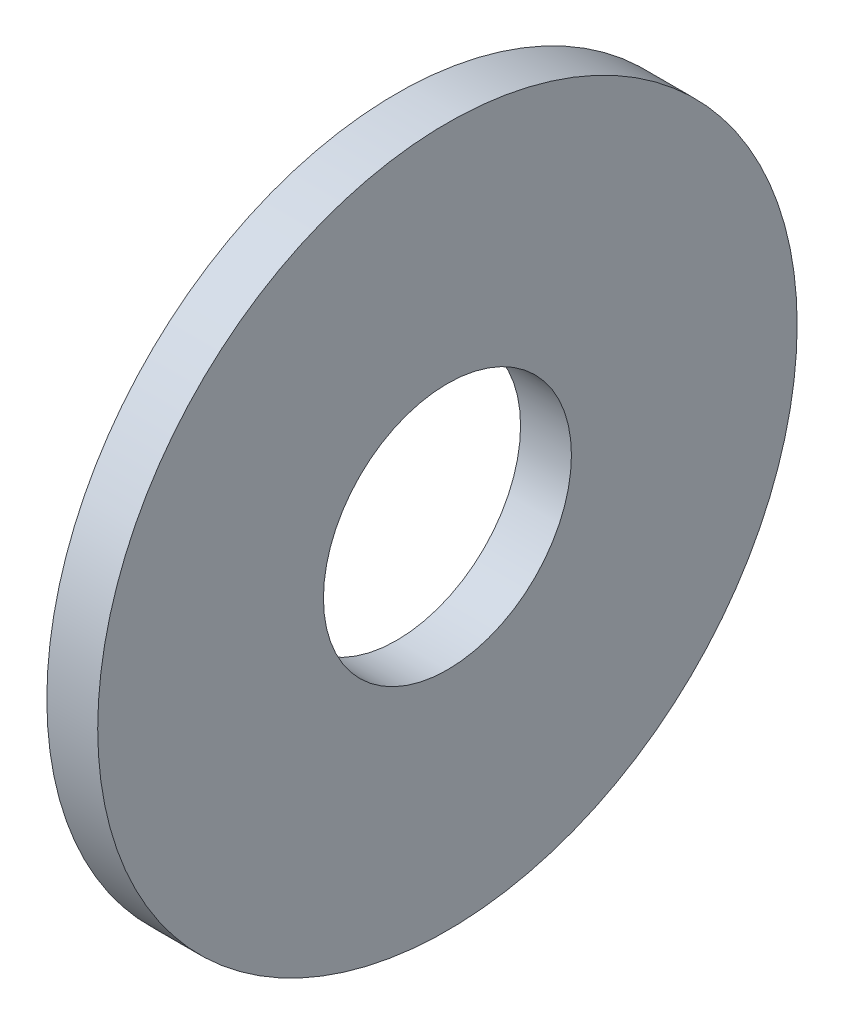
ISO-10303-21;
HEADER;
FILE_DESCRIPTION(('STEP AP214'),'2;1');
FILE_NAME('part.step','',(''),(''),'','','');
FILE_SCHEMA(('AUTOMOTIVE_DESIGN { 1 0 10303 214 1 1 1 1 }'));
ENDSEC;
DATA;
#1=APPLICATION_CONTEXT('core data for automotive mechanical design processes');
#2=APPLICATION_PROTOCOL_DEFINITION('international standard','automotive_design',2000,#1);
#3=PRODUCT_CONTEXT('',#1,'mechanical');
#4=PRODUCT('Part','Part','',(#3));
#5=PRODUCT_RELATED_PRODUCT_CATEGORY('part','',(#4));
#6=PRODUCT_DEFINITION_FORMATION('','',#4);
#7=PRODUCT_DEFINITION_CONTEXT('part definition',#1,'design');
#8=PRODUCT_DEFINITION('design','',#6,#7);
#9=PRODUCT_DEFINITION_SHAPE('','',#8);
#10=(LENGTH_UNIT() NAMED_UNIT(*) SI_UNIT(.MILLI.,.METRE.));
#11=(NAMED_UNIT(*) PLANE_ANGLE_UNIT() SI_UNIT($,.RADIAN.));
#12=(NAMED_UNIT(*) SI_UNIT($,.STERADIAN.) SOLID_ANGLE_UNIT());
#13=UNCERTAINTY_MEASURE_WITH_UNIT(LENGTH_MEASURE(1.E-05),#10,'distance_accuracy_value','');
#14=(GEOMETRIC_REPRESENTATION_CONTEXT(3) GLOBAL_UNCERTAINTY_ASSIGNED_CONTEXT((#13)) GLOBAL_UNIT_ASSIGNED_CONTEXT((#10,
#11,#12)) REPRESENTATION_CONTEXT('',''));
#15=CARTESIAN_POINT('',(0.,0.,0.));
#16=DIRECTION('',(0.,0.,1.));
#17=DIRECTION('',(1.,0.,0.));
#18=AXIS2_PLACEMENT_3D('',#15,#16,#17);
#19=CARTESIAN_POINT('',(-34.9249999999999,0.,0.));
#20=DIRECTION('',(-1.,0.,0.));
#21=DIRECTION('',(0.,0.,1.));
#22=AXIS2_PLACEMENT_3D('',#19,#20,#21);
#23=CYLINDRICAL_SURFACE('',#22,19.5);
#24=CARTESIAN_POINT('',(0.,0.,0.));
#25=DIRECTION('',(-1.,0.,0.));
#26=DIRECTION('',(0.,0.,1.));
#27=AXIS2_PLACEMENT_3D('',#24,#25,#26);
#28=CIRCLE('',#27,19.5);
#29=CARTESIAN_POINT('',(0.,0.,19.5));
#30=VERTEX_POINT('',#29);
#31=EDGE_CURVE('E10',#30,#30,#28,.T.);
#32=ORIENTED_EDGE('',*,*,#31,.F.);
#33=EDGE_LOOP('',(#32));
#34=FACE_BOUND('',#33,.T.);
#35=CARTESIAN_POINT('',(-8.,0.,0.));
#36=DIRECTION('',(-1.,0.,0.));
#37=DIRECTION('',(0.,0.,1.));
#38=AXIS2_PLACEMENT_3D('',#35,#36,#37);
#39=CIRCLE('',#38,19.5);
#40=CARTESIAN_POINT('',(-8.,0.,19.5));
#41=VERTEX_POINT('',#40);
#42=EDGE_CURVE('E53',#41,#41,#39,.T.);
#43=ORIENTED_EDGE('',*,*,#42,.T.);
#44=EDGE_LOOP('',(#43));
#45=FACE_BOUND('',#44,.T.);
#46=ADVANCED_FACE('F39',(#34,#45),#23,.F.);
#47=CARTESIAN_POINT('',(0.,19.5,0.));
#48=DIRECTION('',(-1.,0.,0.));
#49=DIRECTION('',(0.,0.,1.));
#50=AXIS2_PLACEMENT_3D('',#47,#48,#49);
#51=PLANE('',#50);
#52=CARTESIAN_POINT('',(0.,0.,0.));
#53=DIRECTION('',(-1.,0.,0.));
#54=DIRECTION('',(0.,0.,1.));
#55=AXIS2_PLACEMENT_3D('',#52,#53,#54);
#56=CIRCLE('',#55,55.);
#57=CARTESIAN_POINT('',(0.,0.,55.));
#58=VERTEX_POINT('',#57);
#59=EDGE_CURVE('E45',#58,#58,#56,.T.);
#60=ORIENTED_EDGE('',*,*,#59,.F.);
#61=EDGE_LOOP('',(#60));
#62=FACE_BOUND('',#61,.T.);
#63=ORIENTED_EDGE('',*,*,#31,.T.);
#64=EDGE_LOOP('',(#63));
#65=FACE_BOUND('',#64,.T.);
#66=ADVANCED_FACE('F68',(#62,#65),#51,.F.);
#67=CARTESIAN_POINT('',(-34.9249999999999,0.,0.));
#68=DIRECTION('',(-1.,0.,0.));
#69=DIRECTION('',(0.,0.,1.));
#70=AXIS2_PLACEMENT_3D('',#67,#68,#69);
#71=CYLINDRICAL_SURFACE('',#70,55.);
#72=CARTESIAN_POINT('',(-8.,0.,0.));
#73=DIRECTION('',(-1.,0.,0.));
#74=DIRECTION('',(0.,0.,1.));
#75=AXIS2_PLACEMENT_3D('',#72,#73,#74);
#76=CIRCLE('',#75,55.);
#77=CARTESIAN_POINT('',(-8.,0.,55.));
#78=VERTEX_POINT('',#77);
#79=EDGE_CURVE('E49',#78,#78,#76,.T.);
#80=ORIENTED_EDGE('',*,*,#79,.F.);
#81=EDGE_LOOP('',(#80));
#82=FACE_BOUND('',#81,.T.);
#83=ORIENTED_EDGE('',*,*,#59,.T.);
#84=EDGE_LOOP('',(#83));
#85=FACE_BOUND('',#84,.T.);
#86=ADVANCED_FACE('F63',(#82,#85),#71,.T.);
#87=CARTESIAN_POINT('',(-8.,55.,0.));
#88=DIRECTION('',(1.,0.,0.));
#89=DIRECTION('',(0.,0.,-1.));
#90=AXIS2_PLACEMENT_3D('',#87,#88,#89);
#91=PLANE('',#90);
#92=ORIENTED_EDGE('',*,*,#42,.F.);
#93=EDGE_LOOP('',(#92));
#94=FACE_BOUND('',#93,.T.);
#95=ORIENTED_EDGE('',*,*,#79,.T.);
#96=EDGE_LOOP('',(#95));
#97=FACE_BOUND('',#96,.T.);
#98=ADVANCED_FACE('F60',(#94,#97),#91,.F.);
#99=CLOSED_SHELL('',(#46,#66,#86,#98));
#100=MANIFOLD_SOLID_BREP('B2',#99);
#101=ADVANCED_BREP_SHAPE_REPRESENTATION('',(#18,#100),#14);
#102=SHAPE_DEFINITION_REPRESENTATION(#9,#101);
ENDSEC;
END-ISO-10303-21;
